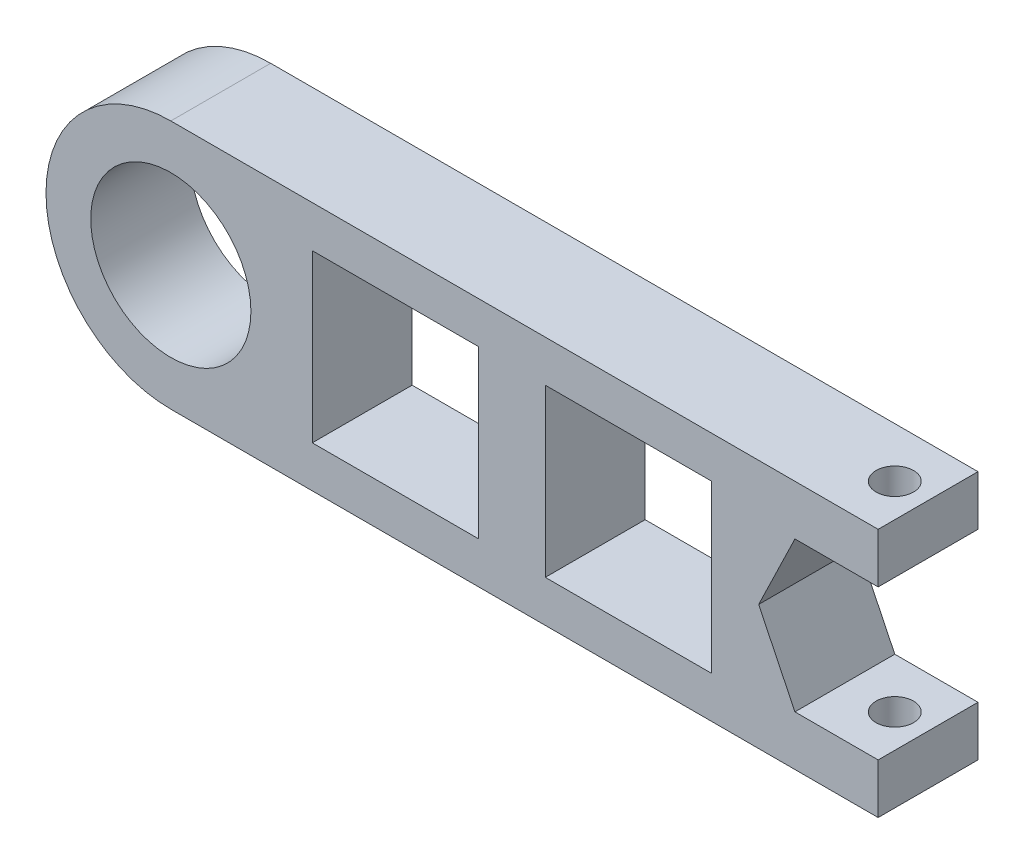
ISO-10303-21;
HEADER;
FILE_DESCRIPTION(('STEP AP214'),'2;1');
FILE_NAME('part.step','',(''),(''),'','','');
FILE_SCHEMA(('AUTOMOTIVE_DESIGN { 1 0 10303 214 1 1 1 1 }'));
ENDSEC;
DATA;
#1=APPLICATION_CONTEXT('core data for automotive mechanical design processes');
#2=APPLICATION_PROTOCOL_DEFINITION('international standard','automotive_design',2000,#1);
#3=PRODUCT_CONTEXT('',#1,'mechanical');
#4=PRODUCT('Part','Part','',(#3));
#5=PRODUCT_RELATED_PRODUCT_CATEGORY('part','',(#4));
#6=PRODUCT_DEFINITION_FORMATION('','',#4);
#7=PRODUCT_DEFINITION_CONTEXT('part definition',#1,'design');
#8=PRODUCT_DEFINITION('design','',#6,#7);
#9=PRODUCT_DEFINITION_SHAPE('','',#8);
#10=(LENGTH_UNIT() NAMED_UNIT(*) SI_UNIT(.MILLI.,.METRE.));
#11=(NAMED_UNIT(*) PLANE_ANGLE_UNIT() SI_UNIT($,.RADIAN.));
#12=(NAMED_UNIT(*) SI_UNIT($,.STERADIAN.) SOLID_ANGLE_UNIT());
#13=UNCERTAINTY_MEASURE_WITH_UNIT(LENGTH_MEASURE(1.E-05),#10,'distance_accuracy_value','');
#14=(GEOMETRIC_REPRESENTATION_CONTEXT(3) GLOBAL_UNCERTAINTY_ASSIGNED_CONTEXT((#13)) GLOBAL_UNIT_ASSIGNED_CONTEXT((#10,
#11,#12)) REPRESENTATION_CONTEXT('',''));
#15=CARTESIAN_POINT('',(0.,0.,0.));
#16=DIRECTION('',(0.,0.,1.));
#17=DIRECTION('',(1.,0.,0.));
#18=AXIS2_PLACEMENT_3D('',#15,#16,#17);
#19=CARTESIAN_POINT('',(-85.,0.,12.));
#20=DIRECTION('',(0.,0.,1.));
#21=DIRECTION('',(1.,0.,0.));
#22=AXIS2_PLACEMENT_3D('',#19,#20,#21);
#23=PLANE('',#22);
#24=DIRECTION('',(0.,1.,0.));
#25=VECTOR('',#24,1.);
#26=CARTESIAN_POINT('',(-20.,10.,12.));
#27=LINE('',#26,#25);
#28=CARTESIAN_POINT('',(-20.,-9.99999999999998,12.));
#29=VERTEX_POINT('',#28);
#30=CARTESIAN_POINT('',(-20.,10.,12.));
#31=VERTEX_POINT('',#30);
#32=EDGE_CURVE('E48',#29,#31,#27,.T.);
#33=ORIENTED_EDGE('',*,*,#32,.F.);
#34=DIRECTION('',(1.,0.,0.));
#35=VECTOR('',#34,1.);
#36=CARTESIAN_POINT('',(-20.,-9.99999999999998,12.));
#37=LINE('',#36,#35);
#38=CARTESIAN_POINT('',(-40.,-9.99999999999999,12.));
#39=VERTEX_POINT('',#38);
#40=EDGE_CURVE('E173',#39,#29,#37,.T.);
#41=ORIENTED_EDGE('',*,*,#40,.F.);
#42=DIRECTION('',(0.,-1.,0.));
#43=VECTOR('',#42,1.);
#44=CARTESIAN_POINT('',(-40.,10.,12.));
#45=LINE('',#44,#43);
#46=CARTESIAN_POINT('',(-40.,10.,12.));
#47=VERTEX_POINT('',#46);
#48=EDGE_CURVE('E176',#47,#39,#45,.T.);
#49=ORIENTED_EDGE('',*,*,#48,.F.);
#50=DIRECTION('',(-1.,0.,0.));
#51=VECTOR('',#50,1.);
#52=CARTESIAN_POINT('',(-20.,10.,12.));
#53=LINE('',#52,#51);
#54=EDGE_CURVE('E182',#31,#47,#53,.T.);
#55=ORIENTED_EDGE('',*,*,#54,.F.);
#56=EDGE_LOOP('',(#33,#41,#49,#55));
#57=FACE_BOUND('',#56,.T.);
#58=DIRECTION('',(0.,1.,0.));
#59=VECTOR('',#58,1.);
#60=CARTESIAN_POINT('',(-48.,10.,12.));
#61=LINE('',#60,#59);
#62=CARTESIAN_POINT('',(-48.,-9.99999999999998,12.));
#63=VERTEX_POINT('',#62);
#64=CARTESIAN_POINT('',(-48.,10.,12.));
#65=VERTEX_POINT('',#64);
#66=EDGE_CURVE('E56',#63,#65,#61,.T.);
#67=ORIENTED_EDGE('',*,*,#66,.F.);
#68=DIRECTION('',(1.,0.,0.));
#69=VECTOR('',#68,1.);
#70=CARTESIAN_POINT('',(-48.,-9.99999999999998,12.));
#71=LINE('',#70,#69);
#72=CARTESIAN_POINT('',(-68.,-9.99999999999999,12.));
#73=VERTEX_POINT('',#72);
#74=EDGE_CURVE('E197',#73,#63,#71,.T.);
#75=ORIENTED_EDGE('',*,*,#74,.F.);
#76=DIRECTION('',(0.,-1.,0.));
#77=VECTOR('',#76,1.);
#78=CARTESIAN_POINT('',(-68.,10.,12.));
#79=LINE('',#78,#77);
#80=CARTESIAN_POINT('',(-68.,10.,12.));
#81=VERTEX_POINT('',#80);
#82=EDGE_CURVE('E211',#81,#73,#79,.T.);
#83=ORIENTED_EDGE('',*,*,#82,.F.);
#84=DIRECTION('',(-1.,0.,0.));
#85=VECTOR('',#84,1.);
#86=CARTESIAN_POINT('',(-48.,10.,12.));
#87=LINE('',#86,#85);
#88=EDGE_CURVE('E208',#65,#81,#87,.T.);
#89=ORIENTED_EDGE('',*,*,#88,.F.);
#90=EDGE_LOOP('',(#67,#75,#83,#89));
#91=FACE_BOUND('',#90,.T.);
#92=DIRECTION('',(1.,0.,0.));
#93=VECTOR('',#92,1.);
#94=CARTESIAN_POINT('',(0.,9.00000000000001,12.));
#95=LINE('',#94,#93);
#96=CARTESIAN_POINT('',(-10.,9.00000000000001,12.));
#97=VERTEX_POINT('',#96);
#98=CARTESIAN_POINT('',(0.,9.00000000000001,12.));
#99=VERTEX_POINT('',#98);
#100=EDGE_CURVE('E237',#97,#99,#95,.T.);
#101=ORIENTED_EDGE('',*,*,#100,.T.);
#102=DIRECTION('',(0.,1.,0.));
#103=VECTOR('',#102,1.);
#104=CARTESIAN_POINT('',(0.,15.,12.));
#105=LINE('',#104,#103);
#106=CARTESIAN_POINT('',(0.,15.,12.));
#107=VERTEX_POINT('',#106);
#108=EDGE_CURVE('E240',#99,#107,#105,.T.);
#109=ORIENTED_EDGE('',*,*,#108,.T.);
#110=DIRECTION('',(-1.,0.,0.));
#111=VECTOR('',#110,1.);
#112=CARTESIAN_POINT('',(-85.,15.,12.));
#113=LINE('',#112,#111);
#114=CARTESIAN_POINT('',(-85.,15.,12.));
#115=VERTEX_POINT('',#114);
#116=EDGE_CURVE('E243',#107,#115,#113,.T.);
#117=ORIENTED_EDGE('',*,*,#116,.T.);
#118=CARTESIAN_POINT('',(-85.,0.,12.));
#119=DIRECTION('',(0.,0.,1.));
#120=DIRECTION('',(1.,0.,0.));
#121=AXIS2_PLACEMENT_3D('',#118,#119,#120);
#122=CIRCLE('',#121,15.);
#123=CARTESIAN_POINT('',(-85.,-15.,12.));
#124=VERTEX_POINT('',#123);
#125=EDGE_CURVE('E245',#115,#124,#122,.T.);
#126=ORIENTED_EDGE('',*,*,#125,.T.);
#127=DIRECTION('',(1.,0.,0.));
#128=VECTOR('',#127,1.);
#129=CARTESIAN_POINT('',(-85.,-15.,12.));
#130=LINE('',#129,#128);
#131=CARTESIAN_POINT('',(0.,-14.9999999999997,12.));
#132=VERTEX_POINT('',#131);
#133=EDGE_CURVE('E247',#124,#132,#130,.T.);
#134=ORIENTED_EDGE('',*,*,#133,.T.);
#135=DIRECTION('',(0.,1.,0.));
#136=VECTOR('',#135,1.);
#137=CARTESIAN_POINT('',(0.,-8.99999999999967,12.));
#138=LINE('',#137,#136);
#139=CARTESIAN_POINT('',(0.,-8.99999999999967,12.));
#140=VERTEX_POINT('',#139);
#141=EDGE_CURVE('E249',#132,#140,#138,.T.);
#142=ORIENTED_EDGE('',*,*,#141,.T.);
#143=DIRECTION('',(-1.,0.,0.));
#144=VECTOR('',#143,1.);
#145=CARTESIAN_POINT('',(-10.,-8.99999999999966,12.));
#146=LINE('',#145,#144);
#147=CARTESIAN_POINT('',(-10.,-8.99999999999966,12.));
#148=VERTEX_POINT('',#147);
#149=EDGE_CURVE('E251',#140,#148,#146,.T.);
#150=ORIENTED_EDGE('',*,*,#149,.T.);
#151=DIRECTION('',(-0.435889894354108,0.89999999999998,0.));
#152=VECTOR('',#151,1.);
#153=CARTESIAN_POINT('',(-14.358898943541,0.,12.));
#154=LINE('',#153,#152);
#155=CARTESIAN_POINT('',(-14.358898943541,0.,12.));
#156=VERTEX_POINT('',#155);
#157=EDGE_CURVE('E253',#148,#156,#154,.T.);
#158=ORIENTED_EDGE('',*,*,#157,.T.);
#159=DIRECTION('',(0.435889894354095,0.899999999999987,0.));
#160=VECTOR('',#159,1.);
#161=CARTESIAN_POINT('',(-10.,9.00000000000001,12.));
#162=LINE('',#161,#160);
#163=EDGE_CURVE('E255',#156,#97,#162,.T.);
#164=ORIENTED_EDGE('',*,*,#163,.T.);
#165=EDGE_LOOP('',(#101,#109,#117,#126,#134,#142,#150,#158,#164));
#166=FACE_BOUND('',#165,.T.);
#167=CARTESIAN_POINT('',(-85.,0.,12.));
#168=DIRECTION('',(0.,0.,1.));
#169=DIRECTION('',(1.,0.,0.));
#170=AXIS2_PLACEMENT_3D('',#167,#168,#169);
#171=CIRCLE('',#170,9.625);
#172=CARTESIAN_POINT('',(-75.375,0.,12.));
#173=VERTEX_POINT('',#172);
#174=EDGE_CURVE('E231',#173,#173,#171,.T.);
#175=ORIENTED_EDGE('',*,*,#174,.F.);
#176=EDGE_LOOP('',(#175));
#177=FACE_BOUND('',#176,.T.);
#178=ADVANCED_FACE('F32',(#57,#91,#166,#177),#23,.T.);
#179=CARTESIAN_POINT('',(-85.,0.,0.));
#180=DIRECTION('',(0.,0.,1.));
#181=DIRECTION('',(1.,0.,0.));
#182=AXIS2_PLACEMENT_3D('',#179,#180,#181);
#183=PLANE('',#182);
#184=DIRECTION('',(1.,0.,0.));
#185=VECTOR('',#184,1.);
#186=CARTESIAN_POINT('',(-20.,-9.99999999999998,0.));
#187=LINE('',#186,#185);
#188=CARTESIAN_POINT('',(-40.,-9.99999999999999,0.));
#189=VERTEX_POINT('',#188);
#190=CARTESIAN_POINT('',(-20.,-9.99999999999998,0.));
#191=VERTEX_POINT('',#190);
#192=EDGE_CURVE('E160',#189,#191,#187,.T.);
#193=ORIENTED_EDGE('',*,*,#192,.T.);
#194=DIRECTION('',(0.,1.,0.));
#195=VECTOR('',#194,1.);
#196=CARTESIAN_POINT('',(-20.,10.,0.));
#197=LINE('',#196,#195);
#198=CARTESIAN_POINT('',(-20.,10.,0.));
#199=VERTEX_POINT('',#198);
#200=EDGE_CURVE('E154',#191,#199,#197,.T.);
#201=ORIENTED_EDGE('',*,*,#200,.T.);
#202=DIRECTION('',(-1.,0.,0.));
#203=VECTOR('',#202,1.);
#204=CARTESIAN_POINT('',(-20.,10.,0.));
#205=LINE('',#204,#203);
#206=CARTESIAN_POINT('',(-40.,10.,0.));
#207=VERTEX_POINT('',#206);
#208=EDGE_CURVE('E164',#199,#207,#205,.T.);
#209=ORIENTED_EDGE('',*,*,#208,.T.);
#210=DIRECTION('',(0.,-1.,0.));
#211=VECTOR('',#210,1.);
#212=CARTESIAN_POINT('',(-40.,10.,0.));
#213=LINE('',#212,#211);
#214=EDGE_CURVE('E168',#207,#189,#213,.T.);
#215=ORIENTED_EDGE('',*,*,#214,.T.);
#216=EDGE_LOOP('',(#193,#201,#209,#215));
#217=FACE_BOUND('',#216,.T.);
#218=DIRECTION('',(1.,0.,0.));
#219=VECTOR('',#218,1.);
#220=CARTESIAN_POINT('',(-48.,-9.99999999999998,0.));
#221=LINE('',#220,#219);
#222=CARTESIAN_POINT('',(-68.,-9.99999999999999,0.));
#223=VERTEX_POINT('',#222);
#224=CARTESIAN_POINT('',(-48.,-9.99999999999998,0.));
#225=VERTEX_POINT('',#224);
#226=EDGE_CURVE('E203',#223,#225,#221,.T.);
#227=ORIENTED_EDGE('',*,*,#226,.T.);
#228=DIRECTION('',(0.,1.,0.));
#229=VECTOR('',#228,1.);
#230=CARTESIAN_POINT('',(-48.,10.,0.));
#231=LINE('',#230,#229);
#232=CARTESIAN_POINT('',(-48.,10.,0.));
#233=VERTEX_POINT('',#232);
#234=EDGE_CURVE('E193',#225,#233,#231,.T.);
#235=ORIENTED_EDGE('',*,*,#234,.T.);
#236=DIRECTION('',(-1.,0.,0.));
#237=VECTOR('',#236,1.);
#238=CARTESIAN_POINT('',(-48.,10.,0.));
#239=LINE('',#238,#237);
#240=CARTESIAN_POINT('',(-68.,10.,0.));
#241=VERTEX_POINT('',#240);
#242=EDGE_CURVE('E196',#233,#241,#239,.T.);
#243=ORIENTED_EDGE('',*,*,#242,.T.);
#244=DIRECTION('',(0.,-1.,0.));
#245=VECTOR('',#244,1.);
#246=CARTESIAN_POINT('',(-68.,10.,0.));
#247=LINE('',#246,#245);
#248=EDGE_CURVE('E200',#241,#223,#247,.T.);
#249=ORIENTED_EDGE('',*,*,#248,.T.);
#250=EDGE_LOOP('',(#227,#235,#243,#249));
#251=FACE_BOUND('',#250,.T.);
#252=DIRECTION('',(1.,0.,0.));
#253=VECTOR('',#252,1.);
#254=CARTESIAN_POINT('',(0.,9.00000000000001,0.));
#255=LINE('',#254,#253);
#256=CARTESIAN_POINT('',(-10.,9.00000000000001,0.));
#257=VERTEX_POINT('',#256);
#258=CARTESIAN_POINT('',(0.,9.00000000000001,0.));
#259=VERTEX_POINT('',#258);
#260=EDGE_CURVE('E234',#257,#259,#255,.T.);
#261=ORIENTED_EDGE('',*,*,#260,.F.);
#262=DIRECTION('',(0.435889894354095,0.899999999999987,0.));
#263=VECTOR('',#262,1.);
#264=CARTESIAN_POINT('',(-10.,9.00000000000001,0.));
#265=LINE('',#264,#263);
#266=CARTESIAN_POINT('',(-14.358898943541,0.,0.));
#267=VERTEX_POINT('',#266);
#268=EDGE_CURVE('E241',#267,#257,#265,.T.);
#269=ORIENTED_EDGE('',*,*,#268,.F.);
#270=DIRECTION('',(-0.435889894354108,0.89999999999998,0.));
#271=VECTOR('',#270,1.);
#272=CARTESIAN_POINT('',(-14.358898943541,0.,0.));
#273=LINE('',#272,#271);
#274=CARTESIAN_POINT('',(-10.,-8.99999999999966,0.));
#275=VERTEX_POINT('',#274);
#276=EDGE_CURVE('E272',#275,#267,#273,.T.);
#277=ORIENTED_EDGE('',*,*,#276,.F.);
#278=DIRECTION('',(-1.,0.,0.));
#279=VECTOR('',#278,1.);
#280=CARTESIAN_POINT('',(-10.,-8.99999999999966,0.));
#281=LINE('',#280,#279);
#282=CARTESIAN_POINT('',(0.,-8.99999999999967,0.));
#283=VERTEX_POINT('',#282);
#284=EDGE_CURVE('E270',#283,#275,#281,.T.);
#285=ORIENTED_EDGE('',*,*,#284,.F.);
#286=DIRECTION('',(0.,1.,0.));
#287=VECTOR('',#286,1.);
#288=CARTESIAN_POINT('',(0.,-8.99999999999967,0.));
#289=LINE('',#288,#287);
#290=CARTESIAN_POINT('',(0.,-14.9999999999997,0.));
#291=VERTEX_POINT('',#290);
#292=EDGE_CURVE('E268',#291,#283,#289,.T.);
#293=ORIENTED_EDGE('',*,*,#292,.F.);
#294=DIRECTION('',(1.,0.,0.));
#295=VECTOR('',#294,1.);
#296=CARTESIAN_POINT('',(-85.,-15.,0.));
#297=LINE('',#296,#295);
#298=CARTESIAN_POINT('',(-85.,-15.,0.));
#299=VERTEX_POINT('',#298);
#300=EDGE_CURVE('E266',#299,#291,#297,.T.);
#301=ORIENTED_EDGE('',*,*,#300,.F.);
#302=CARTESIAN_POINT('',(-85.,0.,0.));
#303=DIRECTION('',(0.,0.,1.));
#304=DIRECTION('',(1.,0.,0.));
#305=AXIS2_PLACEMENT_3D('',#302,#303,#304);
#306=CIRCLE('',#305,15.);
#307=CARTESIAN_POINT('',(-85.,15.,0.));
#308=VERTEX_POINT('',#307);
#309=EDGE_CURVE('E264',#308,#299,#306,.T.);
#310=ORIENTED_EDGE('',*,*,#309,.F.);
#311=DIRECTION('',(-1.,0.,0.));
#312=VECTOR('',#311,1.);
#313=CARTESIAN_POINT('',(-85.,15.,0.));
#314=LINE('',#313,#312);
#315=CARTESIAN_POINT('',(0.,15.,0.));
#316=VERTEX_POINT('',#315);
#317=EDGE_CURVE('E262',#316,#308,#314,.T.);
#318=ORIENTED_EDGE('',*,*,#317,.F.);
#319=DIRECTION('',(0.,1.,0.));
#320=VECTOR('',#319,1.);
#321=CARTESIAN_POINT('',(0.,15.,0.));
#322=LINE('',#321,#320);
#323=EDGE_CURVE('E260',#259,#316,#322,.T.);
#324=ORIENTED_EDGE('',*,*,#323,.F.);
#325=EDGE_LOOP('',(#261,#269,#277,#285,#293,#301,#310,#318,#324));
#326=FACE_BOUND('',#325,.T.);
#327=CARTESIAN_POINT('',(-85.,0.,0.));
#328=DIRECTION('',(0.,0.,1.));
#329=DIRECTION('',(1.,0.,0.));
#330=AXIS2_PLACEMENT_3D('',#327,#328,#329);
#331=CIRCLE('',#330,9.625);
#332=CARTESIAN_POINT('',(-75.375,0.,0.));
#333=VERTEX_POINT('',#332);
#334=EDGE_CURVE('E230',#333,#333,#331,.T.);
#335=ORIENTED_EDGE('',*,*,#334,.T.);
#336=EDGE_LOOP('',(#335));
#337=FACE_BOUND('',#336,.T.);
#338=ADVANCED_FACE('F170',(#217,#251,#326,#337),#183,.F.);
#339=CARTESIAN_POINT('',(0.,9.00000000000001,12.));
#340=DIRECTION('',(0.,1.,0.));
#341=DIRECTION('',(0.,0.,1.));
#342=AXIS2_PLACEMENT_3D('',#339,#340,#341);
#343=PLANE('',#342);
#344=CARTESIAN_POINT('',(-4.00000000000004,9.00000000000001,6.));
#345=DIRECTION('',(0.,1.,0.));
#346=DIRECTION('',(0.,0.,1.));
#347=AXIS2_PLACEMENT_3D('',#344,#345,#346);
#348=CIRCLE('',#347,2.25);
#349=CARTESIAN_POINT('',(-4.00000000000004,9.00000000000001,8.25));
#350=VERTEX_POINT('',#349);
#351=EDGE_CURVE('E227',#350,#350,#348,.T.);
#352=ORIENTED_EDGE('',*,*,#351,.T.);
#353=EDGE_LOOP('',(#352));
#354=FACE_BOUND('',#353,.T.);
#355=ORIENTED_EDGE('',*,*,#260,.T.);
#356=DIRECTION('',(0.,0.,-1.));
#357=VECTOR('',#356,1.);
#358=CARTESIAN_POINT('',(0.,9.00000000000001,12.));
#359=LINE('',#358,#357);
#360=EDGE_CURVE('E11',#99,#259,#359,.T.);
#361=ORIENTED_EDGE('',*,*,#360,.F.);
#362=ORIENTED_EDGE('',*,*,#100,.F.);
#363=DIRECTION('',(0.,0.,-1.));
#364=VECTOR('',#363,1.);
#365=CARTESIAN_POINT('',(-10.,9.00000000000001,12.));
#366=LINE('',#365,#364);
#367=EDGE_CURVE('E257',#97,#257,#366,.T.);
#368=ORIENTED_EDGE('',*,*,#367,.T.);
#369=EDGE_LOOP('',(#355,#361,#362,#368));
#370=FACE_BOUND('',#369,.T.);
#371=ADVANCED_FACE('F34',(#354,#370),#343,.F.);
#372=CARTESIAN_POINT('',(0.,15.,12.));
#373=DIRECTION('',(-1.,0.,0.));
#374=DIRECTION('',(0.,-1.,0.));
#375=AXIS2_PLACEMENT_3D('',#372,#373,#374);
#376=PLANE('',#375);
#377=ORIENTED_EDGE('',*,*,#323,.T.);
#378=DIRECTION('',(0.,0.,-1.));
#379=VECTOR('',#378,1.);
#380=CARTESIAN_POINT('',(0.,15.,12.));
#381=LINE('',#380,#379);
#382=EDGE_CURVE('E41',#107,#316,#381,.T.);
#383=ORIENTED_EDGE('',*,*,#382,.F.);
#384=ORIENTED_EDGE('',*,*,#108,.F.);
#385=ORIENTED_EDGE('',*,*,#360,.T.);
#386=EDGE_LOOP('',(#377,#383,#384,#385));
#387=FACE_BOUND('',#386,.T.);
#388=ADVANCED_FACE('F323',(#387),#376,.F.);
#389=CARTESIAN_POINT('',(-85.,15.,12.));
#390=DIRECTION('',(0.,-1.,0.));
#391=DIRECTION('',(1.,0.,0.));
#392=AXIS2_PLACEMENT_3D('',#389,#390,#391);
#393=PLANE('',#392);
#394=CARTESIAN_POINT('',(-4.00000000000006,15.0000000000004,6.));
#395=DIRECTION('',(0.,-1.,0.));
#396=DIRECTION('',(1.,0.,0.));
#397=AXIS2_PLACEMENT_3D('',#394,#395,#396);
#398=CIRCLE('',#397,2.25);
#399=CARTESIAN_POINT('',(-1.75000000000006,15.0000000000004,6.));
#400=VERTEX_POINT('',#399);
#401=EDGE_CURVE('E222',#400,#400,#398,.T.);
#402=ORIENTED_EDGE('',*,*,#401,.T.);
#403=EDGE_LOOP('',(#402));
#404=FACE_BOUND('',#403,.T.);
#405=ORIENTED_EDGE('',*,*,#317,.T.);
#406=DIRECTION('',(0.,0.,-1.));
#407=VECTOR('',#406,1.);
#408=CARTESIAN_POINT('',(-85.,15.,12.));
#409=LINE('',#408,#407);
#410=EDGE_CURVE('E292',#115,#308,#409,.T.);
#411=ORIENTED_EDGE('',*,*,#410,.F.);
#412=ORIENTED_EDGE('',*,*,#116,.F.);
#413=ORIENTED_EDGE('',*,*,#382,.T.);
#414=EDGE_LOOP('',(#405,#411,#412,#413));
#415=FACE_BOUND('',#414,.T.);
#416=ADVANCED_FACE('F300',(#404,#415),#393,.F.);
#417=CARTESIAN_POINT('',(-85.,0.,12.));
#418=DIRECTION('',(0.,0.,-1.));
#419=DIRECTION('',(-1.,0.,0.));
#420=AXIS2_PLACEMENT_3D('',#417,#418,#419);
#421=CYLINDRICAL_SURFACE('',#420,15.);
#422=ORIENTED_EDGE('',*,*,#309,.T.);
#423=DIRECTION('',(0.,0.,-1.));
#424=VECTOR('',#423,1.);
#425=CARTESIAN_POINT('',(-85.,-15.,12.));
#426=LINE('',#425,#424);
#427=EDGE_CURVE('E289',#124,#299,#426,.T.);
#428=ORIENTED_EDGE('',*,*,#427,.F.);
#429=ORIENTED_EDGE('',*,*,#125,.F.);
#430=ORIENTED_EDGE('',*,*,#410,.T.);
#431=EDGE_LOOP('',(#422,#428,#429,#430));
#432=FACE_BOUND('',#431,.T.);
#433=ADVANCED_FACE('F311',(#432),#421,.T.);
#434=CARTESIAN_POINT('',(-85.,-15.,12.));
#435=DIRECTION('',(0.,1.,0.));
#436=DIRECTION('',(-1.,0.,0.));
#437=AXIS2_PLACEMENT_3D('',#434,#435,#436);
#438=PLANE('',#437);
#439=CARTESIAN_POINT('',(-3.99999999999994,-14.9999999999997,6.));
#440=DIRECTION('',(0.,-1.,0.));
#441=DIRECTION('',(1.,0.,0.));
#442=AXIS2_PLACEMENT_3D('',#439,#440,#441);
#443=CIRCLE('',#442,2.25);
#444=CARTESIAN_POINT('',(-1.74999999999994,-14.9999999999997,6.));
#445=VERTEX_POINT('',#444);
#446=EDGE_CURVE('E189',#445,#445,#443,.T.);
#447=ORIENTED_EDGE('',*,*,#446,.F.);
#448=EDGE_LOOP('',(#447));
#449=FACE_BOUND('',#448,.T.);
#450=ORIENTED_EDGE('',*,*,#300,.T.);
#451=DIRECTION('',(0.,0.,-1.));
#452=VECTOR('',#451,1.);
#453=CARTESIAN_POINT('',(0.,-14.9999999999997,12.));
#454=LINE('',#453,#452);
#455=EDGE_CURVE('E286',#132,#291,#454,.T.);
#456=ORIENTED_EDGE('',*,*,#455,.F.);
#457=ORIENTED_EDGE('',*,*,#133,.F.);
#458=ORIENTED_EDGE('',*,*,#427,.T.);
#459=EDGE_LOOP('',(#450,#456,#457,#458));
#460=FACE_BOUND('',#459,.T.);
#461=ADVANCED_FACE('F315',(#449,#460),#438,.F.);
#462=CARTESIAN_POINT('',(0.,-8.99999999999967,12.));
#463=DIRECTION('',(-1.,0.,0.));
#464=DIRECTION('',(0.,-1.,0.));
#465=AXIS2_PLACEMENT_3D('',#462,#463,#464);
#466=PLANE('',#465);
#467=ORIENTED_EDGE('',*,*,#292,.T.);
#468=DIRECTION('',(0.,0.,-1.));
#469=VECTOR('',#468,1.);
#470=CARTESIAN_POINT('',(0.,-8.99999999999967,12.));
#471=LINE('',#470,#469);
#472=EDGE_CURVE('E283',#140,#283,#471,.T.);
#473=ORIENTED_EDGE('',*,*,#472,.F.);
#474=ORIENTED_EDGE('',*,*,#141,.F.);
#475=ORIENTED_EDGE('',*,*,#455,.T.);
#476=EDGE_LOOP('',(#467,#473,#474,#475));
#477=FACE_BOUND('',#476,.T.);
#478=ADVANCED_FACE('F341',(#477),#466,.F.);
#479=CARTESIAN_POINT('',(-10.,-8.99999999999966,12.));
#480=DIRECTION('',(0.,-1.,0.));
#481=DIRECTION('',(1.,0.,0.));
#482=AXIS2_PLACEMENT_3D('',#479,#480,#481);
#483=PLANE('',#482);
#484=CARTESIAN_POINT('',(-3.99999999999997,-8.99999999999966,6.));
#485=DIRECTION('',(0.,-1.,0.));
#486=DIRECTION('',(1.,0.,0.));
#487=AXIS2_PLACEMENT_3D('',#484,#485,#486);
#488=CIRCLE('',#487,2.25);
#489=CARTESIAN_POINT('',(-1.74999999999997,-8.99999999999966,6.));
#490=VERTEX_POINT('',#489);
#491=EDGE_CURVE('E36',#490,#490,#488,.T.);
#492=ORIENTED_EDGE('',*,*,#491,.T.);
#493=EDGE_LOOP('',(#492));
#494=FACE_BOUND('',#493,.T.);
#495=ORIENTED_EDGE('',*,*,#284,.T.);
#496=DIRECTION('',(0.,0.,-1.));
#497=VECTOR('',#496,1.);
#498=CARTESIAN_POINT('',(-10.,-8.99999999999966,12.));
#499=LINE('',#498,#497);
#500=EDGE_CURVE('E280',#148,#275,#499,.T.);
#501=ORIENTED_EDGE('',*,*,#500,.F.);
#502=ORIENTED_EDGE('',*,*,#149,.F.);
#503=ORIENTED_EDGE('',*,*,#472,.T.);
#504=EDGE_LOOP('',(#495,#501,#502,#503));
#505=FACE_BOUND('',#504,.T.);
#506=ADVANCED_FACE('F339',(#494,#505),#483,.F.);
#507=CARTESIAN_POINT('',(-14.358898943541,0.,12.));
#508=DIRECTION('',(-0.89999999999998,-0.435889894354108,0.));
#509=DIRECTION('',(0.435889894354108,-0.89999999999998,0.));
#510=AXIS2_PLACEMENT_3D('',#507,#508,#509);
#511=PLANE('',#510);
#512=ORIENTED_EDGE('',*,*,#276,.T.);
#513=DIRECTION('',(0.,0.,-1.));
#514=VECTOR('',#513,1.);
#515=CARTESIAN_POINT('',(-14.358898943541,0.,12.));
#516=LINE('',#515,#514);
#517=EDGE_CURVE('E277',#156,#267,#516,.T.);
#518=ORIENTED_EDGE('',*,*,#517,.F.);
#519=ORIENTED_EDGE('',*,*,#157,.F.);
#520=ORIENTED_EDGE('',*,*,#500,.T.);
#521=EDGE_LOOP('',(#512,#518,#519,#520));
#522=FACE_BOUND('',#521,.T.);
#523=ADVANCED_FACE('F335',(#522),#511,.F.);
#524=CARTESIAN_POINT('',(-10.,9.00000000000001,12.));
#525=DIRECTION('',(-0.899999999999987,0.435889894354095,0.));
#526=DIRECTION('',(-0.435889894354095,-0.899999999999987,0.));
#527=AXIS2_PLACEMENT_3D('',#524,#525,#526);
#528=PLANE('',#527);
#529=ORIENTED_EDGE('',*,*,#268,.T.);
#530=ORIENTED_EDGE('',*,*,#367,.F.);
#531=ORIENTED_EDGE('',*,*,#163,.F.);
#532=ORIENTED_EDGE('',*,*,#517,.T.);
#533=EDGE_LOOP('',(#529,#530,#531,#532));
#534=FACE_BOUND('',#533,.T.);
#535=ADVANCED_FACE('F330',(#534),#528,.F.);
#536=CARTESIAN_POINT('',(-85.,0.,12.));
#537=DIRECTION('',(0.,0.,-1.));
#538=DIRECTION('',(-1.,0.,0.));
#539=AXIS2_PLACEMENT_3D('',#536,#537,#538);
#540=CYLINDRICAL_SURFACE('',#539,9.625);
#541=ORIENTED_EDGE('',*,*,#174,.T.);
#542=EDGE_LOOP('',(#541));
#543=FACE_BOUND('',#542,.T.);
#544=ORIENTED_EDGE('',*,*,#334,.F.);
#545=EDGE_LOOP('',(#544));
#546=FACE_BOUND('',#545,.T.);
#547=ADVANCED_FACE('F361',(#543,#546),#540,.F.);
#548=CARTESIAN_POINT('',(-4.00000000000006,15.0000000000004,6.));
#549=DIRECTION('',(0.,-1.,0.));
#550=DIRECTION('',(1.,0.,0.));
#551=AXIS2_PLACEMENT_3D('',#548,#549,#550);
#552=CYLINDRICAL_SURFACE('',#551,2.25);
#553=ORIENTED_EDGE('',*,*,#446,.T.);
#554=EDGE_LOOP('',(#553));
#555=FACE_BOUND('',#554,.T.);
#556=ORIENTED_EDGE('',*,*,#491,.F.);
#557=EDGE_LOOP('',(#556));
#558=FACE_BOUND('',#557,.T.);
#559=ADVANCED_FACE('F381',(#555,#558),#552,.F.);
#560=ORIENTED_EDGE('',*,*,#401,.F.);
#561=EDGE_LOOP('',(#560));
#562=FACE_BOUND('',#561,.T.);
#563=ORIENTED_EDGE('',*,*,#351,.F.);
#564=EDGE_LOOP('',(#563));
#565=FACE_BOUND('',#564,.T.);
#566=ADVANCED_FACE('F389',(#562,#565),#552,.F.);
#567=CARTESIAN_POINT('',(-48.,10.,0.));
#568=DIRECTION('',(1.,0.,0.));
#569=DIRECTION('',(0.,0.,-1.));
#570=AXIS2_PLACEMENT_3D('',#567,#568,#569);
#571=PLANE('',#570);
#572=ORIENTED_EDGE('',*,*,#66,.T.);
#573=DIRECTION('',(0.,0.,1.));
#574=VECTOR('',#573,1.);
#575=CARTESIAN_POINT('',(-48.,10.,0.));
#576=LINE('',#575,#574);
#577=EDGE_CURVE('E206',#233,#65,#576,.T.);
#578=ORIENTED_EDGE('',*,*,#577,.F.);
#579=ORIENTED_EDGE('',*,*,#234,.F.);
#580=DIRECTION('',(0.,0.,1.));
#581=VECTOR('',#580,1.);
#582=CARTESIAN_POINT('',(-48.,-9.99999999999998,0.));
#583=LINE('',#582,#581);
#584=EDGE_CURVE('E183',#225,#63,#583,.T.);
#585=ORIENTED_EDGE('',*,*,#584,.T.);
#586=EDGE_LOOP('',(#572,#578,#579,#585));
#587=FACE_BOUND('',#586,.T.);
#588=ADVANCED_FACE('F396',(#587),#571,.F.);
#589=CARTESIAN_POINT('',(-48.,-9.99999999999998,0.));
#590=DIRECTION('',(0.,-1.,0.));
#591=DIRECTION('',(1.,0.,0.));
#592=AXIS2_PLACEMENT_3D('',#589,#590,#591);
#593=PLANE('',#592);
#594=ORIENTED_EDGE('',*,*,#74,.T.);
#595=ORIENTED_EDGE('',*,*,#584,.F.);
#596=ORIENTED_EDGE('',*,*,#226,.F.);
#597=DIRECTION('',(0.,0.,1.));
#598=VECTOR('',#597,1.);
#599=CARTESIAN_POINT('',(-68.,-9.99999999999999,0.));
#600=LINE('',#599,#598);
#601=EDGE_CURVE('E217',#223,#73,#600,.T.);
#602=ORIENTED_EDGE('',*,*,#601,.T.);
#603=EDGE_LOOP('',(#594,#595,#596,#602));
#604=FACE_BOUND('',#603,.T.);
#605=ADVANCED_FACE('F403',(#604),#593,.F.);
#606=CARTESIAN_POINT('',(-68.,10.,0.));
#607=DIRECTION('',(-1.,0.,0.));
#608=DIRECTION('',(0.,0.,1.));
#609=AXIS2_PLACEMENT_3D('',#606,#607,#608);
#610=PLANE('',#609);
#611=ORIENTED_EDGE('',*,*,#82,.T.);
#612=ORIENTED_EDGE('',*,*,#601,.F.);
#613=ORIENTED_EDGE('',*,*,#248,.F.);
#614=DIRECTION('',(0.,0.,1.));
#615=VECTOR('',#614,1.);
#616=CARTESIAN_POINT('',(-68.,10.,0.));
#617=LINE('',#616,#615);
#618=EDGE_CURVE('E219',#241,#81,#617,.T.);
#619=ORIENTED_EDGE('',*,*,#618,.T.);
#620=EDGE_LOOP('',(#611,#612,#613,#619));
#621=FACE_BOUND('',#620,.T.);
#622=ADVANCED_FACE('F411',(#621),#610,.F.);
#623=CARTESIAN_POINT('',(-48.,10.,0.));
#624=DIRECTION('',(0.,1.,0.));
#625=DIRECTION('',(-1.,0.,0.));
#626=AXIS2_PLACEMENT_3D('',#623,#624,#625);
#627=PLANE('',#626);
#628=ORIENTED_EDGE('',*,*,#88,.T.);
#629=ORIENTED_EDGE('',*,*,#618,.F.);
#630=ORIENTED_EDGE('',*,*,#242,.F.);
#631=ORIENTED_EDGE('',*,*,#577,.T.);
#632=EDGE_LOOP('',(#628,#629,#630,#631));
#633=FACE_BOUND('',#632,.T.);
#634=ADVANCED_FACE('F419',(#633),#627,.F.);
#635=CARTESIAN_POINT('',(-20.,10.,0.));
#636=DIRECTION('',(1.,0.,0.));
#637=DIRECTION('',(0.,1.,0.));
#638=AXIS2_PLACEMENT_3D('',#635,#636,#637);
#639=PLANE('',#638);
#640=ORIENTED_EDGE('',*,*,#32,.T.);
#641=DIRECTION('',(0.,0.,1.));
#642=VECTOR('',#641,1.);
#643=CARTESIAN_POINT('',(-20.,10.,0.));
#644=LINE('',#643,#642);
#645=EDGE_CURVE('E150',#199,#31,#644,.T.);
#646=ORIENTED_EDGE('',*,*,#645,.F.);
#647=ORIENTED_EDGE('',*,*,#200,.F.);
#648=DIRECTION('',(0.,0.,1.));
#649=VECTOR('',#648,1.);
#650=CARTESIAN_POINT('',(-20.,-9.99999999999998,0.));
#651=LINE('',#650,#649);
#652=EDGE_CURVE('E187',#191,#29,#651,.T.);
#653=ORIENTED_EDGE('',*,*,#652,.T.);
#654=EDGE_LOOP('',(#640,#646,#647,#653));
#655=FACE_BOUND('',#654,.T.);
#656=ADVANCED_FACE('F152',(#655),#639,.F.);
#657=CARTESIAN_POINT('',(-20.,-9.99999999999998,0.));
#658=DIRECTION('',(0.,-1.,0.));
#659=DIRECTION('',(1.,0.,0.));
#660=AXIS2_PLACEMENT_3D('',#657,#658,#659);
#661=PLANE('',#660);
#662=ORIENTED_EDGE('',*,*,#40,.T.);
#663=ORIENTED_EDGE('',*,*,#652,.F.);
#664=ORIENTED_EDGE('',*,*,#192,.F.);
#665=DIRECTION('',(0.,0.,1.));
#666=VECTOR('',#665,1.);
#667=CARTESIAN_POINT('',(-40.,-9.99999999999999,0.));
#668=LINE('',#667,#666);
#669=EDGE_CURVE('E190',#189,#39,#668,.T.);
#670=ORIENTED_EDGE('',*,*,#669,.T.);
#671=EDGE_LOOP('',(#662,#663,#664,#670));
#672=FACE_BOUND('',#671,.T.);
#673=ADVANCED_FACE('F434',(#672),#661,.F.);
#674=CARTESIAN_POINT('',(-40.,10.,0.));
#675=DIRECTION('',(-1.,0.,0.));
#676=DIRECTION('',(0.,-1.,0.));
#677=AXIS2_PLACEMENT_3D('',#674,#675,#676);
#678=PLANE('',#677);
#679=ORIENTED_EDGE('',*,*,#48,.T.);
#680=ORIENTED_EDGE('',*,*,#669,.F.);
#681=ORIENTED_EDGE('',*,*,#214,.F.);
#682=DIRECTION('',(0.,0.,1.));
#683=VECTOR('',#682,1.);
#684=CARTESIAN_POINT('',(-40.,10.,0.));
#685=LINE('',#684,#683);
#686=EDGE_CURVE('E159',#207,#47,#685,.T.);
#687=ORIENTED_EDGE('',*,*,#686,.T.);
#688=EDGE_LOOP('',(#679,#680,#681,#687));
#689=FACE_BOUND('',#688,.T.);
#690=ADVANCED_FACE('F441',(#689),#678,.F.);
#691=CARTESIAN_POINT('',(-20.,10.,0.));
#692=DIRECTION('',(0.,1.,0.));
#693=DIRECTION('',(-1.,0.,0.));
#694=AXIS2_PLACEMENT_3D('',#691,#692,#693);
#695=PLANE('',#694);
#696=ORIENTED_EDGE('',*,*,#54,.T.);
#697=ORIENTED_EDGE('',*,*,#686,.F.);
#698=ORIENTED_EDGE('',*,*,#208,.F.);
#699=ORIENTED_EDGE('',*,*,#645,.T.);
#700=EDGE_LOOP('',(#696,#697,#698,#699));
#701=FACE_BOUND('',#700,.T.);
#702=ADVANCED_FACE('F165',(#701),#695,.F.);
#703=CLOSED_SHELL('',(#178,#338,#371,#388,#416,#433,#461,#478,#506,#523,#535,#547,#559,#566,
#588,#605,#622,#634,#656,#673,#690,#702));
#704=MANIFOLD_SOLID_BREP('B2',#703);
#705=ADVANCED_BREP_SHAPE_REPRESENTATION('',(#18,#704),#14);
#706=SHAPE_DEFINITION_REPRESENTATION(#9,#705);
ENDSEC;
END-ISO-10303-21;
